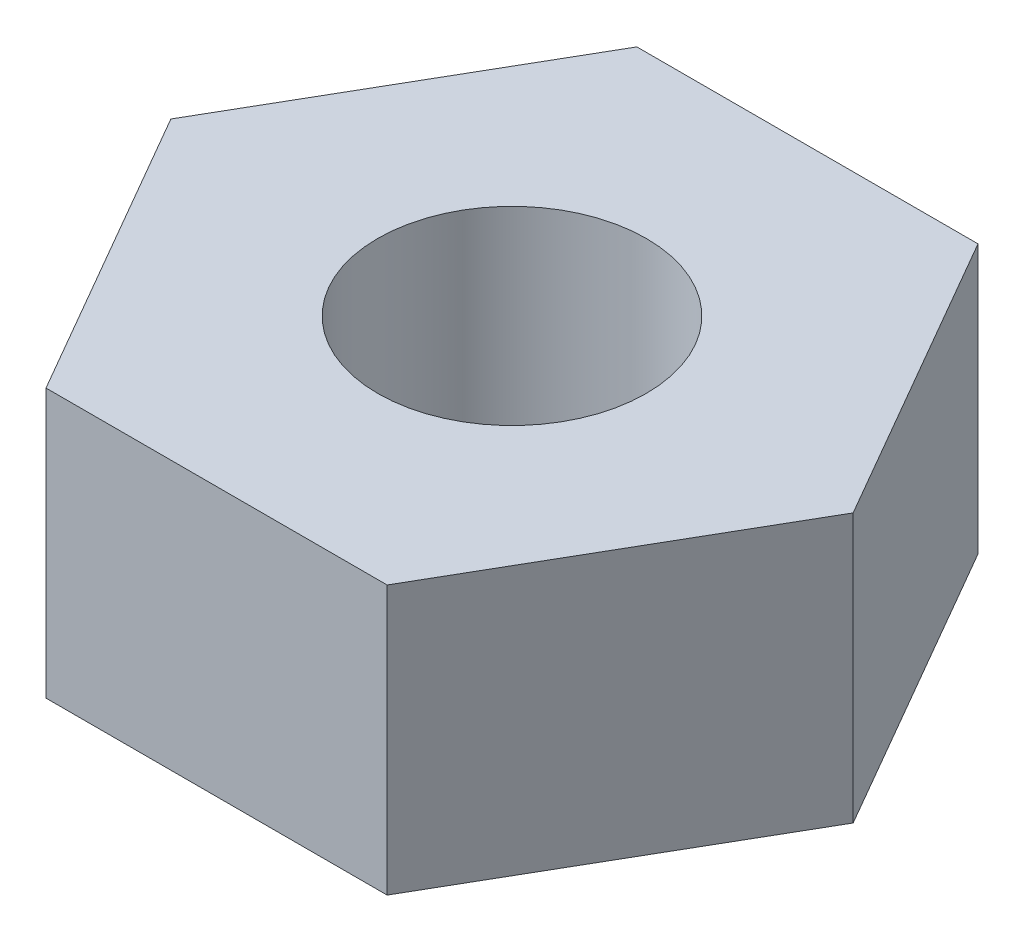
ISO-10303-21;
HEADER;
FILE_DESCRIPTION(('STEP AP214'),'2;1');
FILE_NAME('part.step','',(''),(''),'','','');
FILE_SCHEMA(('AUTOMOTIVE_DESIGN { 1 0 10303 214 1 1 1 1 }'));
ENDSEC;
DATA;
#1=APPLICATION_CONTEXT('core data for automotive mechanical design processes');
#2=APPLICATION_PROTOCOL_DEFINITION('international standard','automotive_design',2000,#1);
#3=PRODUCT_CONTEXT('',#1,'mechanical');
#4=PRODUCT('Part','Part','',(#3));
#5=PRODUCT_RELATED_PRODUCT_CATEGORY('part','',(#4));
#6=PRODUCT_DEFINITION_FORMATION('','',#4);
#7=PRODUCT_DEFINITION_CONTEXT('part definition',#1,'design');
#8=PRODUCT_DEFINITION('design','',#6,#7);
#9=PRODUCT_DEFINITION_SHAPE('','',#8);
#10=(LENGTH_UNIT() NAMED_UNIT(*) SI_UNIT(.MILLI.,.METRE.));
#11=(NAMED_UNIT(*) PLANE_ANGLE_UNIT() SI_UNIT($,.RADIAN.));
#12=(NAMED_UNIT(*) SI_UNIT($,.STERADIAN.) SOLID_ANGLE_UNIT());
#13=UNCERTAINTY_MEASURE_WITH_UNIT(LENGTH_MEASURE(1.E-05),#10,'distance_accuracy_value','');
#14=(GEOMETRIC_REPRESENTATION_CONTEXT(3) GLOBAL_UNCERTAINTY_ASSIGNED_CONTEXT((#13)) GLOBAL_UNIT_ASSIGNED_CONTEXT((#10,
#11,#12)) REPRESENTATION_CONTEXT('',''));
#15=CARTESIAN_POINT('',(0.,0.,0.));
#16=DIRECTION('',(0.,0.,1.));
#17=DIRECTION('',(1.,0.,0.));
#18=AXIS2_PLACEMENT_3D('',#15,#16,#17);
#19=CARTESIAN_POINT('',(1.5877132402715,1.25,2.74999999999997));
#20=DIRECTION('',(-0.866025403784442,0.,-0.499999999999995));
#21=DIRECTION('',(-0.499999999999995,0.,0.866025403784442));
#22=AXIS2_PLACEMENT_3D('',#19,#20,#21);
#23=PLANE('',#22);
#24=DIRECTION('',(0.499999999999995,0.,-0.866025403784441));
#25=VECTOR('',#24,1.);
#26=CARTESIAN_POINT('',(1.5877132402715,-1.25,2.74999999999997));
#27=LINE('',#26,#25);
#28=CARTESIAN_POINT('',(1.5877132402715,-1.25,2.74999999999997));
#29=VERTEX_POINT('',#28);
#30=CARTESIAN_POINT('',(3.17542648054293,-1.25,0.));
#31=VERTEX_POINT('',#30);
#32=EDGE_CURVE('E124',#29,#31,#27,.T.);
#33=ORIENTED_EDGE('',*,*,#32,.T.);
#34=DIRECTION('',(0.,-1.,0.));
#35=VECTOR('',#34,1.);
#36=CARTESIAN_POINT('',(3.17542648054293,1.25,0.));
#37=LINE('',#36,#35);
#38=CARTESIAN_POINT('',(3.17542648054293,1.25,0.));
#39=VERTEX_POINT('',#38);
#40=EDGE_CURVE('E11',#39,#31,#37,.T.);
#41=ORIENTED_EDGE('',*,*,#40,.F.);
#42=DIRECTION('',(0.499999999999995,0.,-0.866025403784441));
#43=VECTOR('',#42,1.);
#44=CARTESIAN_POINT('',(1.5877132402715,1.25,2.74999999999997));
#45=LINE('',#44,#43);
#46=CARTESIAN_POINT('',(1.5877132402715,1.25,2.74999999999997));
#47=VERTEX_POINT('',#46);
#48=EDGE_CURVE('E135',#47,#39,#45,.T.);
#49=ORIENTED_EDGE('',*,*,#48,.F.);
#50=DIRECTION('',(0.,-1.,0.));
#51=VECTOR('',#50,1.);
#52=CARTESIAN_POINT('',(1.5877132402715,1.25,2.74999999999997));
#53=LINE('',#52,#51);
#54=EDGE_CURVE('E120',#47,#29,#53,.T.);
#55=ORIENTED_EDGE('',*,*,#54,.T.);
#56=EDGE_LOOP('',(#33,#41,#49,#55));
#57=FACE_BOUND('',#56,.T.);
#58=ADVANCED_FACE('F40',(#57),#23,.F.);
#59=CARTESIAN_POINT('',(3.17542648054293,1.25,0.));
#60=DIRECTION('',(-0.866025403784438,0.,0.500000000000001));
#61=DIRECTION('',(0.500000000000001,0.,0.866025403784438));
#62=AXIS2_PLACEMENT_3D('',#59,#60,#61);
#63=PLANE('',#62);
#64=DIRECTION('',(-0.500000000000001,0.,-0.866025403784438));
#65=VECTOR('',#64,1.);
#66=CARTESIAN_POINT('',(3.17542648054293,-1.25,0.));
#67=LINE('',#66,#65);
#68=CARTESIAN_POINT('',(1.58771324027146,-1.25,-2.74999999999999));
#69=VERTEX_POINT('',#68);
#70=EDGE_CURVE('E127',#31,#69,#67,.T.);
#71=ORIENTED_EDGE('',*,*,#70,.T.);
#72=DIRECTION('',(0.,-1.,0.));
#73=VECTOR('',#72,1.);
#74=CARTESIAN_POINT('',(1.58771324027146,1.25,-2.74999999999999));
#75=LINE('',#74,#73);
#76=CARTESIAN_POINT('',(1.58771324027146,1.25,-2.74999999999999));
#77=VERTEX_POINT('',#76);
#78=EDGE_CURVE('E48',#77,#69,#75,.T.);
#79=ORIENTED_EDGE('',*,*,#78,.F.);
#80=DIRECTION('',(-0.500000000000001,0.,-0.866025403784438));
#81=VECTOR('',#80,1.);
#82=CARTESIAN_POINT('',(3.17542648054293,1.25,0.));
#83=LINE('',#82,#81);
#84=EDGE_CURVE('E93',#39,#77,#83,.T.);
#85=ORIENTED_EDGE('',*,*,#84,.F.);
#86=ORIENTED_EDGE('',*,*,#40,.T.);
#87=EDGE_LOOP('',(#71,#79,#85,#86));
#88=FACE_BOUND('',#87,.T.);
#89=ADVANCED_FACE('F160',(#88),#63,.F.);
#90=CARTESIAN_POINT('',(1.58771324027146,1.25,-2.74999999999999));
#91=DIRECTION('',(0.,0.,1.));
#92=DIRECTION('',(1.,0.,0.));
#93=AXIS2_PLACEMENT_3D('',#90,#91,#92);
#94=PLANE('',#93);
#95=DIRECTION('',(-1.,0.,0.));
#96=VECTOR('',#95,1.);
#97=CARTESIAN_POINT('',(1.58771324027146,-1.25,-2.74999999999999));
#98=LINE('',#97,#96);
#99=CARTESIAN_POINT('',(-1.58771324027148,-1.25,-2.74999999999998));
#100=VERTEX_POINT('',#99);
#101=EDGE_CURVE('E130',#69,#100,#98,.T.);
#102=ORIENTED_EDGE('',*,*,#101,.T.);
#103=DIRECTION('',(0.,-1.,0.));
#104=VECTOR('',#103,1.);
#105=CARTESIAN_POINT('',(-1.58771324027148,1.25,-2.74999999999998));
#106=LINE('',#105,#104);
#107=CARTESIAN_POINT('',(-1.58771324027148,1.25,-2.74999999999998));
#108=VERTEX_POINT('',#107);
#109=EDGE_CURVE('E115',#108,#100,#106,.T.);
#110=ORIENTED_EDGE('',*,*,#109,.F.);
#111=DIRECTION('',(-1.,0.,0.));
#112=VECTOR('',#111,1.);
#113=CARTESIAN_POINT('',(1.58771324027146,1.25,-2.74999999999999));
#114=LINE('',#113,#112);
#115=EDGE_CURVE('E106',#77,#108,#114,.T.);
#116=ORIENTED_EDGE('',*,*,#115,.F.);
#117=ORIENTED_EDGE('',*,*,#78,.T.);
#118=EDGE_LOOP('',(#102,#110,#116,#117));
#119=FACE_BOUND('',#118,.T.);
#120=ADVANCED_FACE('F141',(#119),#94,.F.);
#121=CARTESIAN_POINT('',(-1.58771324027148,1.25,-2.74999999999998));
#122=DIRECTION('',(0.866025403784442,0.,0.499999999999995));
#123=DIRECTION('',(0.499999999999995,0.,-0.866025403784442));
#124=AXIS2_PLACEMENT_3D('',#121,#122,#123);
#125=PLANE('',#124);
#126=DIRECTION('',(-0.499999999999995,0.,0.866025403784442));
#127=VECTOR('',#126,1.);
#128=CARTESIAN_POINT('',(-1.58771324027148,-1.25,-2.74999999999998));
#129=LINE('',#128,#127);
#130=CARTESIAN_POINT('',(-3.17542648054293,-1.25,0.));
#131=VERTEX_POINT('',#130);
#132=EDGE_CURVE('E114',#100,#131,#129,.T.);
#133=ORIENTED_EDGE('',*,*,#132,.T.);
#134=DIRECTION('',(0.,-1.,0.));
#135=VECTOR('',#134,1.);
#136=CARTESIAN_POINT('',(-3.17542648054293,1.25,0.));
#137=LINE('',#136,#135);
#138=CARTESIAN_POINT('',(-3.17542648054293,1.25,0.));
#139=VERTEX_POINT('',#138);
#140=EDGE_CURVE('E111',#139,#131,#137,.T.);
#141=ORIENTED_EDGE('',*,*,#140,.F.);
#142=DIRECTION('',(-0.499999999999995,0.,0.866025403784442));
#143=VECTOR('',#142,1.);
#144=CARTESIAN_POINT('',(-1.58771324027148,1.25,-2.74999999999998));
#145=LINE('',#144,#143);
#146=EDGE_CURVE('E100',#108,#139,#145,.T.);
#147=ORIENTED_EDGE('',*,*,#146,.F.);
#148=ORIENTED_EDGE('',*,*,#109,.T.);
#149=EDGE_LOOP('',(#133,#141,#147,#148));
#150=FACE_BOUND('',#149,.T.);
#151=ADVANCED_FACE('F112',(#150),#125,.F.);
#152=CARTESIAN_POINT('',(-3.17542648054293,1.25,0.));
#153=DIRECTION('',(0.866025403784435,0.,-0.500000000000007));
#154=DIRECTION('',(-0.500000000000007,0.,-0.866025403784435));
#155=AXIS2_PLACEMENT_3D('',#152,#153,#154);
#156=PLANE('',#155);
#157=DIRECTION('',(0.500000000000007,0.,0.866025403784435));
#158=VECTOR('',#157,1.);
#159=CARTESIAN_POINT('',(-3.17542648054293,-1.25,0.));
#160=LINE('',#159,#158);
#161=CARTESIAN_POINT('',(-1.58771324027144,-1.25,2.75));
#162=VERTEX_POINT('',#161);
#163=EDGE_CURVE('E79',#131,#162,#160,.T.);
#164=ORIENTED_EDGE('',*,*,#163,.T.);
#165=DIRECTION('',(0.,-1.,0.));
#166=VECTOR('',#165,1.);
#167=CARTESIAN_POINT('',(-1.58771324027144,1.25,2.75));
#168=LINE('',#167,#166);
#169=CARTESIAN_POINT('',(-1.58771324027144,1.25,2.75));
#170=VERTEX_POINT('',#169);
#171=EDGE_CURVE('E116',#170,#162,#168,.T.);
#172=ORIENTED_EDGE('',*,*,#171,.F.);
#173=DIRECTION('',(0.500000000000007,0.,0.866025403784435));
#174=VECTOR('',#173,1.);
#175=CARTESIAN_POINT('',(-3.17542648054293,1.25,0.));
#176=LINE('',#175,#174);
#177=EDGE_CURVE('E104',#139,#170,#176,.T.);
#178=ORIENTED_EDGE('',*,*,#177,.F.);
#179=ORIENTED_EDGE('',*,*,#140,.T.);
#180=EDGE_LOOP('',(#164,#172,#178,#179));
#181=FACE_BOUND('',#180,.T.);
#182=ADVANCED_FACE('F118',(#181),#156,.F.);
#183=CARTESIAN_POINT('',(-1.58771324027144,1.25,2.75));
#184=DIRECTION('',(0.,0.,-1.));
#185=DIRECTION('',(-1.,0.,0.));
#186=AXIS2_PLACEMENT_3D('',#183,#184,#185);
#187=PLANE('',#186);
#188=DIRECTION('',(1.,0.,0.));
#189=VECTOR('',#188,1.);
#190=CARTESIAN_POINT('',(-1.58771324027144,-1.25,2.75));
#191=LINE('',#190,#189);
#192=EDGE_CURVE('E85',#162,#29,#191,.T.);
#193=ORIENTED_EDGE('',*,*,#192,.T.);
#194=ORIENTED_EDGE('',*,*,#54,.F.);
#195=DIRECTION('',(1.,0.,0.));
#196=VECTOR('',#195,1.);
#197=CARTESIAN_POINT('',(-1.58771324027144,1.25,2.75));
#198=LINE('',#197,#196);
#199=EDGE_CURVE('E56',#170,#47,#198,.T.);
#200=ORIENTED_EDGE('',*,*,#199,.F.);
#201=ORIENTED_EDGE('',*,*,#171,.T.);
#202=EDGE_LOOP('',(#193,#194,#200,#201));
#203=FACE_BOUND('',#202,.T.);
#204=ADVANCED_FACE('F148',(#203),#187,.F.);
#205=CARTESIAN_POINT('',(0.,1.25,0.));
#206=DIRECTION('',(0.,1.,0.));
#207=DIRECTION('',(0.,0.,1.));
#208=AXIS2_PLACEMENT_3D('',#205,#206,#207);
#209=PLANE('',#208);
#210=CARTESIAN_POINT('',(0.,1.25,0.));
#211=DIRECTION('',(0.,1.,0.));
#212=DIRECTION('',(0.,0.,1.));
#213=AXIS2_PLACEMENT_3D('',#210,#211,#212);
#214=CIRCLE('',#213,1.24999999999999);
#215=CARTESIAN_POINT('',(0.,1.25,1.24999999999999));
#216=VERTEX_POINT('',#215);
#217=EDGE_CURVE('E220',#216,#216,#214,.T.);
#218=ORIENTED_EDGE('',*,*,#217,.F.);
#219=EDGE_LOOP('',(#218));
#220=FACE_BOUND('',#219,.T.);
#221=ORIENTED_EDGE('',*,*,#48,.T.);
#222=ORIENTED_EDGE('',*,*,#84,.T.);
#223=ORIENTED_EDGE('',*,*,#115,.T.);
#224=ORIENTED_EDGE('',*,*,#146,.T.);
#225=ORIENTED_EDGE('',*,*,#177,.T.);
#226=ORIENTED_EDGE('',*,*,#199,.T.);
#227=EDGE_LOOP('',(#221,#222,#223,#224,#225,#226));
#228=FACE_BOUND('',#227,.T.);
#229=ADVANCED_FACE('F102',(#220,#228),#209,.T.);
#230=CARTESIAN_POINT('',(0.,-1.25,0.));
#231=DIRECTION('',(0.,1.,0.));
#232=DIRECTION('',(0.,0.,1.));
#233=AXIS2_PLACEMENT_3D('',#230,#231,#232);
#234=PLANE('',#233);
#235=CARTESIAN_POINT('',(0.,-1.25,0.));
#236=DIRECTION('',(0.,1.,0.));
#237=DIRECTION('',(0.,0.,1.));
#238=AXIS2_PLACEMENT_3D('',#235,#236,#237);
#239=CIRCLE('',#238,1.25);
#240=CARTESIAN_POINT('',(0.,-1.25,1.25));
#241=VERTEX_POINT('',#240);
#242=EDGE_CURVE('E128',#241,#241,#239,.T.);
#243=ORIENTED_EDGE('',*,*,#242,.T.);
#244=EDGE_LOOP('',(#243));
#245=FACE_BOUND('',#244,.T.);
#246=ORIENTED_EDGE('',*,*,#32,.F.);
#247=ORIENTED_EDGE('',*,*,#192,.F.);
#248=ORIENTED_EDGE('',*,*,#163,.F.);
#249=ORIENTED_EDGE('',*,*,#132,.F.);
#250=ORIENTED_EDGE('',*,*,#101,.F.);
#251=ORIENTED_EDGE('',*,*,#70,.F.);
#252=EDGE_LOOP('',(#246,#247,#248,#249,#250,#251));
#253=FACE_BOUND('',#252,.T.);
#254=ADVANCED_FACE('F144',(#245,#253),#234,.F.);
#255=CARTESIAN_POINT('',(0.,1.25,0.));
#256=DIRECTION('',(0.,1.,0.));
#257=DIRECTION('',(0.,0.,1.));
#258=AXIS2_PLACEMENT_3D('',#255,#256,#257);
#259=CYLINDRICAL_SURFACE('',#258,1.24999999999999);
#260=ORIENTED_EDGE('',*,*,#242,.F.);
#261=EDGE_LOOP('',(#260));
#262=FACE_BOUND('',#261,.T.);
#263=ORIENTED_EDGE('',*,*,#217,.T.);
#264=EDGE_LOOP('',(#263));
#265=FACE_BOUND('',#264,.T.);
#266=ADVANCED_FACE('F199',(#262,#265),#259,.F.);
#267=CLOSED_SHELL('',(#58,#89,#120,#151,#182,#204,#229,#254,#266));
#268=MANIFOLD_SOLID_BREP('B2',#267);
#269=ADVANCED_BREP_SHAPE_REPRESENTATION('',(#18,#268),#14);
#270=SHAPE_DEFINITION_REPRESENTATION(#9,#269);
ENDSEC;
END-ISO-10303-21;
